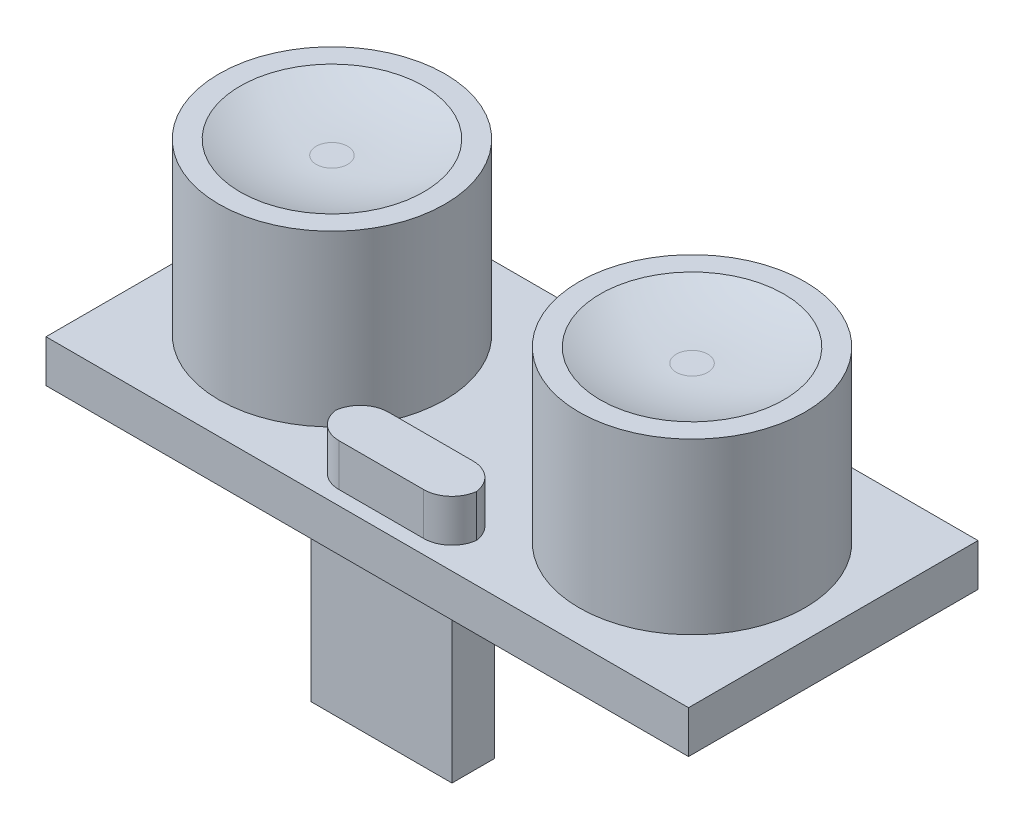
ISO-10303-21;
HEADER;
FILE_DESCRIPTION(('STEP AP214'),'2;1');
FILE_NAME('part.step','',(''),(''),'','','');
FILE_SCHEMA(('AUTOMOTIVE_DESIGN { 1 0 10303 214 1 1 1 1 }'));
ENDSEC;
DATA;
#1=APPLICATION_CONTEXT('core data for automotive mechanical design processes');
#2=APPLICATION_PROTOCOL_DEFINITION('international standard','automotive_design',2000,#1);
#3=PRODUCT_CONTEXT('',#1,'mechanical');
#4=PRODUCT('Part','Part','',(#3));
#5=PRODUCT_RELATED_PRODUCT_CATEGORY('part','',(#4));
#6=PRODUCT_DEFINITION_FORMATION('','',#4);
#7=PRODUCT_DEFINITION_CONTEXT('part definition',#1,'design');
#8=PRODUCT_DEFINITION('design','',#6,#7);
#9=PRODUCT_DEFINITION_SHAPE('','',#8);
#10=(LENGTH_UNIT() NAMED_UNIT(*) SI_UNIT(.MILLI.,.METRE.));
#11=(NAMED_UNIT(*) PLANE_ANGLE_UNIT() SI_UNIT($,.RADIAN.));
#12=(NAMED_UNIT(*) SI_UNIT($,.STERADIAN.) SOLID_ANGLE_UNIT());
#13=UNCERTAINTY_MEASURE_WITH_UNIT(LENGTH_MEASURE(1.E-05),#10,'distance_accuracy_value','');
#14=(GEOMETRIC_REPRESENTATION_CONTEXT(3) GLOBAL_UNCERTAINTY_ASSIGNED_CONTEXT((#13)) GLOBAL_UNIT_ASSIGNED_CONTEXT((#10,
#11,#12)) REPRESENTATION_CONTEXT('',''));
#15=CARTESIAN_POINT('',(0.,0.,0.));
#16=DIRECTION('',(0.,0.,1.));
#17=DIRECTION('',(1.,0.,0.));
#18=AXIS2_PLACEMENT_3D('',#15,#16,#17);
#19=CARTESIAN_POINT('',(0.,3.,0.));
#20=DIRECTION('',(0.,-1.,0.));
#21=DIRECTION('',(0.,0.,-1.));
#22=AXIS2_PLACEMENT_3D('',#19,#20,#21);
#23=PLANE('',#22);
#24=DIRECTION('',(0.,0.,1.));
#25=VECTOR('',#24,1.);
#26=CARTESIAN_POINT('',(0.,3.,0.));
#27=LINE('',#26,#25);
#28=CARTESIAN_POINT('',(0.,3.,-20.5));
#29=VERTEX_POINT('',#28);
#30=CARTESIAN_POINT('',(0.,3.,0.));
#31=VERTEX_POINT('',#30);
#32=EDGE_CURVE('E186',#29,#31,#27,.T.);
#33=ORIENTED_EDGE('',*,*,#32,.T.);
#34=DIRECTION('',(1.,0.,0.));
#35=VECTOR('',#34,1.);
#36=CARTESIAN_POINT('',(0.,3.,0.));
#37=LINE('',#36,#35);
#38=CARTESIAN_POINT('',(45.5,3.,0.));
#39=VERTEX_POINT('',#38);
#40=EDGE_CURVE('E190',#31,#39,#37,.T.);
#41=ORIENTED_EDGE('',*,*,#40,.T.);
#42=DIRECTION('',(0.,0.,-1.));
#43=VECTOR('',#42,1.);
#44=CARTESIAN_POINT('',(45.5,3.,0.));
#45=LINE('',#44,#43);
#46=CARTESIAN_POINT('',(45.5,3.,-20.5));
#47=VERTEX_POINT('',#46);
#48=EDGE_CURVE('E194',#39,#47,#45,.T.);
#49=ORIENTED_EDGE('',*,*,#48,.T.);
#50=DIRECTION('',(-1.,0.,0.));
#51=VECTOR('',#50,1.);
#52=CARTESIAN_POINT('',(0.,3.,-20.5));
#53=LINE('',#52,#51);
#54=EDGE_CURVE('E197',#47,#29,#53,.T.);
#55=ORIENTED_EDGE('',*,*,#54,.T.);
#56=EDGE_LOOP('',(#33,#41,#49,#55));
#57=FACE_BOUND('',#56,.T.);
#58=CARTESIAN_POINT('',(10.,3.,-10.25));
#59=DIRECTION('',(0.,-1.,0.));
#60=DIRECTION('',(0.,0.,-1.));
#61=AXIS2_PLACEMENT_3D('',#58,#59,#60);
#62=CIRCLE('',#61,8.);
#63=CARTESIAN_POINT('',(10.,3.,-18.25));
#64=VERTEX_POINT('',#63);
#65=EDGE_CURVE('E227',#64,#64,#62,.F.);
#66=ORIENTED_EDGE('',*,*,#65,.F.);
#67=EDGE_LOOP('',(#66));
#68=FACE_BOUND('',#67,.T.);
#69=CARTESIAN_POINT('',(35.5,3.,-10.25));
#70=DIRECTION('',(0.,-1.,0.));
#71=DIRECTION('',(0.,0.,-1.));
#72=AXIS2_PLACEMENT_3D('',#69,#70,#71);
#73=CIRCLE('',#72,8.);
#74=CARTESIAN_POINT('',(35.5,3.,-18.25));
#75=VERTEX_POINT('',#74);
#76=EDGE_CURVE('E231',#75,#75,#73,.F.);
#77=ORIENTED_EDGE('',*,*,#76,.F.);
#78=EDGE_LOOP('',(#77));
#79=FACE_BOUND('',#78,.T.);
#80=CARTESIAN_POINT('',(19.75,3.,-3.));
#81=DIRECTION('',(0.,-1.,0.));
#82=DIRECTION('',(0.,0.,-1.));
#83=AXIS2_PLACEMENT_3D('',#80,#81,#82);
#84=CIRCLE('',#83,2.);
#85=CARTESIAN_POINT('',(19.75,3.,-1.));
#86=VERTEX_POINT('',#85);
#87=CARTESIAN_POINT('',(17.7656865167016,3.,-2.75));
#88=VERTEX_POINT('',#87);
#89=EDGE_CURVE('E64',#86,#88,#84,.T.);
#90=ORIENTED_EDGE('',*,*,#89,.T.);
#91=CARTESIAN_POINT('',(19.75,3.,-2.5));
#92=DIRECTION('',(0.,-1.,0.));
#93=DIRECTION('',(0.,0.,-1.));
#94=AXIS2_PLACEMENT_3D('',#91,#92,#93);
#95=CIRCLE('',#94,2.);
#96=CARTESIAN_POINT('',(19.75,3.,-4.5));
#97=VERTEX_POINT('',#96);
#98=EDGE_CURVE('E271',#88,#97,#95,.T.);
#99=ORIENTED_EDGE('',*,*,#98,.T.);
#100=DIRECTION('',(-1.,0.,0.));
#101=VECTOR('',#100,1.);
#102=CARTESIAN_POINT('',(17.75,3.,-4.5));
#103=LINE('',#102,#101);
#104=CARTESIAN_POINT('',(25.75,3.,-4.5));
#105=VERTEX_POINT('',#104);
#106=EDGE_CURVE('E285',#105,#97,#103,.T.);
#107=ORIENTED_EDGE('',*,*,#106,.F.);
#108=CARTESIAN_POINT('',(25.75,3.,-2.5));
#109=DIRECTION('',(0.,-1.,0.));
#110=DIRECTION('',(0.,0.,-1.));
#111=AXIS2_PLACEMENT_3D('',#108,#109,#110);
#112=CIRCLE('',#111,2.);
#113=CARTESIAN_POINT('',(27.7343134832984,3.,-2.75));
#114=VERTEX_POINT('',#113);
#115=EDGE_CURVE('E11',#105,#114,#112,.T.);
#116=ORIENTED_EDGE('',*,*,#115,.T.);
#117=CARTESIAN_POINT('',(25.75,3.,-3.));
#118=DIRECTION('',(0.,-1.,0.));
#119=DIRECTION('',(0.,0.,-1.));
#120=AXIS2_PLACEMENT_3D('',#117,#118,#119);
#121=CIRCLE('',#120,2.);
#122=CARTESIAN_POINT('',(25.75,3.,-1.));
#123=VERTEX_POINT('',#122);
#124=EDGE_CURVE('E51',#114,#123,#121,.T.);
#125=ORIENTED_EDGE('',*,*,#124,.T.);
#126=DIRECTION('',(1.,0.,0.));
#127=VECTOR('',#126,1.);
#128=CARTESIAN_POINT('',(17.75,3.,-1.));
#129=LINE('',#128,#127);
#130=EDGE_CURVE('E278',#86,#123,#129,.T.);
#131=ORIENTED_EDGE('',*,*,#130,.F.);
#132=EDGE_LOOP('',(#90,#99,#107,#116,#125,#131));
#133=FACE_BOUND('',#132,.T.);
#134=ADVANCED_FACE('F41',(#57,#68,#79,#133),#23,.F.);
#135=CARTESIAN_POINT('',(0.,0.,0.));
#136=DIRECTION('',(0.,-1.,0.));
#137=DIRECTION('',(0.,0.,-1.));
#138=AXIS2_PLACEMENT_3D('',#135,#136,#137);
#139=PLANE('',#138);
#140=DIRECTION('',(0.,0.,1.));
#141=VECTOR('',#140,1.);
#142=CARTESIAN_POINT('',(0.,0.,0.));
#143=LINE('',#142,#141);
#144=CARTESIAN_POINT('',(0.,0.,-20.5));
#145=VERTEX_POINT('',#144);
#146=CARTESIAN_POINT('',(0.,0.,0.));
#147=VERTEX_POINT('',#146);
#148=EDGE_CURVE('E185',#145,#147,#143,.T.);
#149=ORIENTED_EDGE('',*,*,#148,.F.);
#150=DIRECTION('',(-1.,0.,0.));
#151=VECTOR('',#150,1.);
#152=CARTESIAN_POINT('',(0.,0.,-20.5));
#153=LINE('',#152,#151);
#154=CARTESIAN_POINT('',(45.5,0.,-20.5));
#155=VERTEX_POINT('',#154);
#156=EDGE_CURVE('E191',#155,#145,#153,.T.);
#157=ORIENTED_EDGE('',*,*,#156,.F.);
#158=DIRECTION('',(0.,0.,-1.));
#159=VECTOR('',#158,1.);
#160=CARTESIAN_POINT('',(45.5,0.,0.));
#161=LINE('',#160,#159);
#162=CARTESIAN_POINT('',(45.5,0.,0.));
#163=VERTEX_POINT('',#162);
#164=EDGE_CURVE('E207',#163,#155,#161,.T.);
#165=ORIENTED_EDGE('',*,*,#164,.F.);
#166=DIRECTION('',(1.,0.,0.));
#167=VECTOR('',#166,1.);
#168=CARTESIAN_POINT('',(0.,0.,0.));
#169=LINE('',#168,#167);
#170=EDGE_CURVE('E204',#147,#163,#169,.T.);
#171=ORIENTED_EDGE('',*,*,#170,.F.);
#172=EDGE_LOOP('',(#149,#157,#165,#171));
#173=FACE_BOUND('',#172,.T.);
#174=DIRECTION('',(1.,0.,0.));
#175=VECTOR('',#174,1.);
#176=CARTESIAN_POINT('',(17.75,0.,-4.));
#177=LINE('',#176,#175);
#178=CARTESIAN_POINT('',(17.75,0.,-4.));
#179=VERTEX_POINT('',#178);
#180=CARTESIAN_POINT('',(27.75,0.,-4.));
#181=VERTEX_POINT('',#180);
#182=EDGE_CURVE('E329',#179,#181,#177,.T.);
#183=ORIENTED_EDGE('',*,*,#182,.F.);
#184=DIRECTION('',(0.,0.,-1.));
#185=VECTOR('',#184,1.);
#186=CARTESIAN_POINT('',(17.75,0.,-1.));
#187=LINE('',#186,#185);
#188=CARTESIAN_POINT('',(17.75,0.,-1.));
#189=VERTEX_POINT('',#188);
#190=EDGE_CURVE('E168',#189,#179,#187,.T.);
#191=ORIENTED_EDGE('',*,*,#190,.F.);
#192=DIRECTION('',(-1.,0.,0.));
#193=VECTOR('',#192,1.);
#194=CARTESIAN_POINT('',(17.75,0.,-1.));
#195=LINE('',#194,#193);
#196=CARTESIAN_POINT('',(27.75,0.,-1.));
#197=VERTEX_POINT('',#196);
#198=EDGE_CURVE('E164',#197,#189,#195,.T.);
#199=ORIENTED_EDGE('',*,*,#198,.F.);
#200=DIRECTION('',(0.,0.,1.));
#201=VECTOR('',#200,1.);
#202=CARTESIAN_POINT('',(27.75,0.,-1.));
#203=LINE('',#202,#201);
#204=EDGE_CURVE('E332',#181,#197,#203,.T.);
#205=ORIENTED_EDGE('',*,*,#204,.F.);
#206=EDGE_LOOP('',(#183,#191,#199,#205));
#207=FACE_BOUND('',#206,.T.);
#208=ADVANCED_FACE('F348',(#173,#207),#139,.T.);
#209=CARTESIAN_POINT('',(0.,3.,0.));
#210=DIRECTION('',(1.,0.,0.));
#211=DIRECTION('',(0.,0.,-1.));
#212=AXIS2_PLACEMENT_3D('',#209,#210,#211);
#213=PLANE('',#212);
#214=ORIENTED_EDGE('',*,*,#148,.T.);
#215=DIRECTION('',(0.,-1.,0.));
#216=VECTOR('',#215,1.);
#217=CARTESIAN_POINT('',(0.,3.,0.));
#218=LINE('',#217,#216);
#219=EDGE_CURVE('E223',#31,#147,#218,.T.);
#220=ORIENTED_EDGE('',*,*,#219,.F.);
#221=ORIENTED_EDGE('',*,*,#32,.F.);
#222=DIRECTION('',(0.,-1.,0.));
#223=VECTOR('',#222,1.);
#224=CARTESIAN_POINT('',(0.,3.,-20.5));
#225=LINE('',#224,#223);
#226=EDGE_CURVE('E200',#29,#145,#225,.T.);
#227=ORIENTED_EDGE('',*,*,#226,.T.);
#228=EDGE_LOOP('',(#214,#220,#221,#227));
#229=FACE_BOUND('',#228,.T.);
#230=ADVANCED_FACE('F350',(#229),#213,.F.);
#231=CARTESIAN_POINT('',(0.,3.,0.));
#232=DIRECTION('',(0.,0.,-1.));
#233=DIRECTION('',(-1.,0.,0.));
#234=AXIS2_PLACEMENT_3D('',#231,#232,#233);
#235=PLANE('',#234);
#236=ORIENTED_EDGE('',*,*,#170,.T.);
#237=DIRECTION('',(0.,-1.,0.));
#238=VECTOR('',#237,1.);
#239=CARTESIAN_POINT('',(45.5,3.,0.));
#240=LINE('',#239,#238);
#241=EDGE_CURVE('E219',#39,#163,#240,.T.);
#242=ORIENTED_EDGE('',*,*,#241,.F.);
#243=ORIENTED_EDGE('',*,*,#40,.F.);
#244=ORIENTED_EDGE('',*,*,#219,.T.);
#245=EDGE_LOOP('',(#236,#242,#243,#244));
#246=FACE_BOUND('',#245,.T.);
#247=ADVANCED_FACE('F357',(#246),#235,.F.);
#248=CARTESIAN_POINT('',(45.5,3.,0.));
#249=DIRECTION('',(-1.,0.,0.));
#250=DIRECTION('',(0.,0.,1.));
#251=AXIS2_PLACEMENT_3D('',#248,#249,#250);
#252=PLANE('',#251);
#253=ORIENTED_EDGE('',*,*,#164,.T.);
#254=DIRECTION('',(0.,-1.,0.));
#255=VECTOR('',#254,1.);
#256=CARTESIAN_POINT('',(45.5,3.,-20.5));
#257=LINE('',#256,#255);
#258=EDGE_CURVE('E215',#47,#155,#257,.T.);
#259=ORIENTED_EDGE('',*,*,#258,.F.);
#260=ORIENTED_EDGE('',*,*,#48,.F.);
#261=ORIENTED_EDGE('',*,*,#241,.T.);
#262=EDGE_LOOP('',(#253,#259,#260,#261));
#263=FACE_BOUND('',#262,.T.);
#264=ADVANCED_FACE('F369',(#263),#252,.F.);
#265=CARTESIAN_POINT('',(0.,3.,-20.5));
#266=DIRECTION('',(0.,0.,1.));
#267=DIRECTION('',(1.,0.,0.));
#268=AXIS2_PLACEMENT_3D('',#265,#266,#267);
#269=PLANE('',#268);
#270=ORIENTED_EDGE('',*,*,#156,.T.);
#271=ORIENTED_EDGE('',*,*,#226,.F.);
#272=ORIENTED_EDGE('',*,*,#54,.F.);
#273=ORIENTED_EDGE('',*,*,#258,.T.);
#274=EDGE_LOOP('',(#270,#271,#272,#273));
#275=FACE_BOUND('',#274,.T.);
#276=ADVANCED_FACE('F365',(#275),#269,.F.);
#277=CARTESIAN_POINT('',(10.,15.,-10.25));
#278=DIRECTION('',(0.,-1.,0.));
#279=DIRECTION('',(0.,0.,-1.));
#280=AXIS2_PLACEMENT_3D('',#277,#278,#279);
#281=CYLINDRICAL_SURFACE('',#280,8.);
#282=CARTESIAN_POINT('',(10.,15.,-10.25));
#283=DIRECTION('',(0.,1.,0.));
#284=DIRECTION('',(0.,0.,1.));
#285=AXIS2_PLACEMENT_3D('',#282,#283,#284);
#286=CIRCLE('',#285,8.);
#287=CARTESIAN_POINT('',(10.,15.,-2.25));
#288=VERTEX_POINT('',#287);
#289=EDGE_CURVE('E176',#288,#288,#286,.T.);
#290=ORIENTED_EDGE('',*,*,#289,.F.);
#291=EDGE_LOOP('',(#290));
#292=FACE_BOUND('',#291,.T.);
#293=ORIENTED_EDGE('',*,*,#65,.T.);
#294=EDGE_LOOP('',(#293));
#295=FACE_BOUND('',#294,.T.);
#296=ADVANCED_FACE('F368',(#292,#295),#281,.T.);
#297=CARTESIAN_POINT('',(10.,15.,-10.25));
#298=DIRECTION('',(0.,1.,0.));
#299=DIRECTION('',(0.,0.,1.));
#300=AXIS2_PLACEMENT_3D('',#297,#298,#299);
#301=PLANE('',#300);
#302=CARTESIAN_POINT('',(10.,15.,-10.25));
#303=DIRECTION('',(0.,1.,0.));
#304=DIRECTION('',(0.,0.,1.));
#305=AXIS2_PLACEMENT_3D('',#302,#303,#304);
#306=CIRCLE('',#305,6.5);
#307=CARTESIAN_POINT('',(10.,15.,-3.75));
#308=VERTEX_POINT('',#307);
#309=EDGE_CURVE('E313',#308,#308,#306,.T.);
#310=ORIENTED_EDGE('',*,*,#309,.F.);
#311=EDGE_LOOP('',(#310));
#312=FACE_BOUND('',#311,.T.);
#313=ORIENTED_EDGE('',*,*,#289,.T.);
#314=EDGE_LOOP('',(#313));
#315=FACE_BOUND('',#314,.T.);
#316=ADVANCED_FACE('F497',(#312,#315),#301,.T.);
#317=CARTESIAN_POINT('',(35.5,15.,-10.25));
#318=DIRECTION('',(0.,-1.,0.));
#319=DIRECTION('',(0.,0.,-1.));
#320=AXIS2_PLACEMENT_3D('',#317,#318,#319);
#321=CYLINDRICAL_SURFACE('',#320,8.);
#322=CARTESIAN_POINT('',(35.5,15.,-10.25));
#323=DIRECTION('',(0.,1.,0.));
#324=DIRECTION('',(0.,0.,1.));
#325=AXIS2_PLACEMENT_3D('',#322,#323,#324);
#326=CIRCLE('',#325,8.);
#327=CARTESIAN_POINT('',(35.5,15.,-2.25));
#328=VERTEX_POINT('',#327);
#329=EDGE_CURVE('E171',#328,#328,#326,.T.);
#330=ORIENTED_EDGE('',*,*,#329,.F.);
#331=EDGE_LOOP('',(#330));
#332=FACE_BOUND('',#331,.T.);
#333=ORIENTED_EDGE('',*,*,#76,.T.);
#334=EDGE_LOOP('',(#333));
#335=FACE_BOUND('',#334,.T.);
#336=ADVANCED_FACE('F488',(#332,#335),#321,.T.);
#337=CARTESIAN_POINT('',(35.5,15.,-10.25));
#338=DIRECTION('',(0.,1.,0.));
#339=DIRECTION('',(0.,0.,1.));
#340=AXIS2_PLACEMENT_3D('',#337,#338,#339);
#341=PLANE('',#340);
#342=CARTESIAN_POINT('',(35.5,15.,-10.25));
#343=DIRECTION('',(0.,1.,0.));
#344=DIRECTION('',(0.,0.,1.));
#345=AXIS2_PLACEMENT_3D('',#342,#343,#344);
#346=CIRCLE('',#345,6.5);
#347=CARTESIAN_POINT('',(35.5,15.,-3.75));
#348=VERTEX_POINT('',#347);
#349=EDGE_CURVE('E307',#348,#348,#346,.T.);
#350=ORIENTED_EDGE('',*,*,#349,.F.);
#351=EDGE_LOOP('',(#350));
#352=FACE_BOUND('',#351,.T.);
#353=ORIENTED_EDGE('',*,*,#329,.T.);
#354=EDGE_LOOP('',(#353));
#355=FACE_BOUND('',#354,.T.);
#356=ADVANCED_FACE('F481',(#352,#355),#341,.T.);
#357=CARTESIAN_POINT('',(17.75,-11.,-1.));
#358=DIRECTION('',(1.,0.,0.));
#359=DIRECTION('',(0.,0.,-1.));
#360=AXIS2_PLACEMENT_3D('',#357,#358,#359);
#361=PLANE('',#360);
#362=ORIENTED_EDGE('',*,*,#190,.T.);
#363=DIRECTION('',(0.,1.,0.));
#364=VECTOR('',#363,1.);
#365=CARTESIAN_POINT('',(17.75,-11.,-4.));
#366=LINE('',#365,#364);
#367=CARTESIAN_POINT('',(17.75,-11.,-4.));
#368=VERTEX_POINT('',#367);
#369=EDGE_CURVE('E146',#368,#179,#366,.T.);
#370=ORIENTED_EDGE('',*,*,#369,.F.);
#371=DIRECTION('',(0.,0.,-1.));
#372=VECTOR('',#371,1.);
#373=CARTESIAN_POINT('',(17.75,-11.,-1.));
#374=LINE('',#373,#372);
#375=CARTESIAN_POINT('',(17.75,-11.,-1.));
#376=VERTEX_POINT('',#375);
#377=EDGE_CURVE('E154',#376,#368,#374,.T.);
#378=ORIENTED_EDGE('',*,*,#377,.F.);
#379=DIRECTION('',(0.,1.,0.));
#380=VECTOR('',#379,1.);
#381=CARTESIAN_POINT('',(17.75,-11.,-1.));
#382=LINE('',#381,#380);
#383=EDGE_CURVE('E326',#376,#189,#382,.T.);
#384=ORIENTED_EDGE('',*,*,#383,.T.);
#385=EDGE_LOOP('',(#362,#370,#378,#384));
#386=FACE_BOUND('',#385,.T.);
#387=ADVANCED_FACE('F166',(#386),#361,.F.);
#388=CARTESIAN_POINT('',(17.75,-11.,-4.));
#389=DIRECTION('',(0.,0.,1.));
#390=DIRECTION('',(1.,0.,0.));
#391=AXIS2_PLACEMENT_3D('',#388,#389,#390);
#392=PLANE('',#391);
#393=ORIENTED_EDGE('',*,*,#182,.T.);
#394=DIRECTION('',(0.,1.,0.));
#395=VECTOR('',#394,1.);
#396=CARTESIAN_POINT('',(27.75,-11.,-4.));
#397=LINE('',#396,#395);
#398=CARTESIAN_POINT('',(27.75,-11.,-4.));
#399=VERTEX_POINT('',#398);
#400=EDGE_CURVE('E149',#399,#181,#397,.T.);
#401=ORIENTED_EDGE('',*,*,#400,.F.);
#402=DIRECTION('',(1.,0.,0.));
#403=VECTOR('',#402,1.);
#404=CARTESIAN_POINT('',(17.75,-11.,-4.));
#405=LINE('',#404,#403);
#406=EDGE_CURVE('E142',#368,#399,#405,.T.);
#407=ORIENTED_EDGE('',*,*,#406,.F.);
#408=ORIENTED_EDGE('',*,*,#369,.T.);
#409=EDGE_LOOP('',(#393,#401,#407,#408));
#410=FACE_BOUND('',#409,.T.);
#411=ADVANCED_FACE('F144',(#410),#392,.F.);
#412=CARTESIAN_POINT('',(27.75,-11.,-1.));
#413=DIRECTION('',(-1.,0.,0.));
#414=DIRECTION('',(0.,0.,1.));
#415=AXIS2_PLACEMENT_3D('',#412,#413,#414);
#416=PLANE('',#415);
#417=ORIENTED_EDGE('',*,*,#204,.T.);
#418=DIRECTION('',(0.,1.,0.));
#419=VECTOR('',#418,1.);
#420=CARTESIAN_POINT('',(27.75,-11.,-1.));
#421=LINE('',#420,#419);
#422=CARTESIAN_POINT('',(27.75,-11.,-1.));
#423=VERTEX_POINT('',#422);
#424=EDGE_CURVE('E178',#423,#197,#421,.T.);
#425=ORIENTED_EDGE('',*,*,#424,.F.);
#426=DIRECTION('',(0.,0.,1.));
#427=VECTOR('',#426,1.);
#428=CARTESIAN_POINT('',(27.75,-11.,-1.));
#429=LINE('',#428,#427);
#430=EDGE_CURVE('E153',#399,#423,#429,.T.);
#431=ORIENTED_EDGE('',*,*,#430,.F.);
#432=ORIENTED_EDGE('',*,*,#400,.T.);
#433=EDGE_LOOP('',(#417,#425,#431,#432));
#434=FACE_BOUND('',#433,.T.);
#435=ADVANCED_FACE('F346',(#434),#416,.F.);
#436=CARTESIAN_POINT('',(17.75,-11.,-1.));
#437=DIRECTION('',(0.,0.,-1.));
#438=DIRECTION('',(-1.,0.,0.));
#439=AXIS2_PLACEMENT_3D('',#436,#437,#438);
#440=PLANE('',#439);
#441=ORIENTED_EDGE('',*,*,#198,.T.);
#442=ORIENTED_EDGE('',*,*,#383,.F.);
#443=DIRECTION('',(-1.,0.,0.));
#444=VECTOR('',#443,1.);
#445=CARTESIAN_POINT('',(17.75,-11.,-1.));
#446=LINE('',#445,#444);
#447=EDGE_CURVE('E159',#423,#376,#446,.T.);
#448=ORIENTED_EDGE('',*,*,#447,.F.);
#449=ORIENTED_EDGE('',*,*,#424,.T.);
#450=EDGE_LOOP('',(#441,#442,#448,#449));
#451=FACE_BOUND('',#450,.T.);
#452=ADVANCED_FACE('F342',(#451),#440,.F.);
#453=CARTESIAN_POINT('',(0.,-11.,0.));
#454=DIRECTION('',(0.,-1.,0.));
#455=DIRECTION('',(0.,0.,-1.));
#456=AXIS2_PLACEMENT_3D('',#453,#454,#455);
#457=PLANE('',#456);
#458=ORIENTED_EDGE('',*,*,#377,.T.);
#459=ORIENTED_EDGE('',*,*,#406,.T.);
#460=ORIENTED_EDGE('',*,*,#430,.T.);
#461=ORIENTED_EDGE('',*,*,#447,.T.);
#462=EDGE_LOOP('',(#458,#459,#460,#461));
#463=FACE_BOUND('',#462,.T.);
#464=ADVANCED_FACE('F157',(#463),#457,.T.);
#465=CARTESIAN_POINT('',(35.5,14.,-10.25));
#466=DIRECTION('',(0.,1.,0.));
#467=DIRECTION('',(0.,0.,1.));
#468=AXIS2_PLACEMENT_3D('',#465,#466,#467);
#469=PLANE('',#468);
#470=CARTESIAN_POINT('',(35.5,14.,-10.25));
#471=DIRECTION('',(0.,1.,0.));
#472=DIRECTION('',(0.,0.,1.));
#473=AXIS2_PLACEMENT_3D('',#470,#471,#472);
#474=CIRCLE('',#473,1.11483519286549);
#475=CARTESIAN_POINT('',(35.5,14.,-9.13516480713451));
#476=VERTEX_POINT('',#475);
#477=EDGE_CURVE('E235',#476,#476,#474,.T.);
#478=ORIENTED_EDGE('',*,*,#477,.T.);
#479=EDGE_LOOP('',(#478));
#480=FACE_BOUND('',#479,.T.);
#481=ADVANCED_FACE('F441',(#480),#469,.T.);
#482=CARTESIAN_POINT('',(10.,14.,-10.25));
#483=DIRECTION('',(0.,1.,0.));
#484=DIRECTION('',(0.,0.,1.));
#485=AXIS2_PLACEMENT_3D('',#482,#483,#484);
#486=PLANE('',#485);
#487=CARTESIAN_POINT('',(10.,14.,-10.25));
#488=DIRECTION('',(0.,1.,0.));
#489=DIRECTION('',(0.,0.,1.));
#490=AXIS2_PLACEMENT_3D('',#487,#488,#489);
#491=CIRCLE('',#490,1.11483519286549);
#492=CARTESIAN_POINT('',(10.,14.,-9.13516480713451));
#493=VERTEX_POINT('',#492);
#494=EDGE_CURVE('E239',#493,#493,#491,.T.);
#495=ORIENTED_EDGE('',*,*,#494,.T.);
#496=EDGE_LOOP('',(#495));
#497=FACE_BOUND('',#496,.T.);
#498=ADVANCED_FACE('F381',(#497),#486,.T.);
#499=CARTESIAN_POINT('',(35.5,29.,-10.25));
#500=DIRECTION('',(0.,-1.,0.));
#501=DIRECTION('',(0.,0.,-1.));
#502=AXIS2_PLACEMENT_3D('',#499,#500,#501);
#503=DEGENERATE_TOROIDAL_SURFACE('',#502,1.11483519286549,15.,.T.);
#504=ORIENTED_EDGE('',*,*,#349,.T.);
#505=EDGE_LOOP('',(#504));
#506=FACE_BOUND('',#505,.T.);
#507=ORIENTED_EDGE('',*,*,#477,.F.);
#508=EDGE_LOOP('',(#507));
#509=FACE_BOUND('',#508,.T.);
#510=ADVANCED_FACE('F377',(#506,#509),#503,.F.);
#511=CARTESIAN_POINT('',(10.,29.,-10.25));
#512=DIRECTION('',(0.,-1.,0.));
#513=DIRECTION('',(0.,0.,-1.));
#514=AXIS2_PLACEMENT_3D('',#511,#512,#513);
#515=DEGENERATE_TOROIDAL_SURFACE('',#514,1.11483519286549,15.,.T.);
#516=ORIENTED_EDGE('',*,*,#309,.T.);
#517=EDGE_LOOP('',(#516));
#518=FACE_BOUND('',#517,.T.);
#519=ORIENTED_EDGE('',*,*,#494,.F.);
#520=EDGE_LOOP('',(#519));
#521=FACE_BOUND('',#520,.T.);
#522=ADVANCED_FACE('F380',(#518,#521),#515,.F.);
#523=CARTESIAN_POINT('',(17.75,6.,-1.));
#524=DIRECTION('',(0.,0.,-1.));
#525=DIRECTION('',(-1.,0.,0.));
#526=AXIS2_PLACEMENT_3D('',#523,#524,#525);
#527=PLANE('',#526);
#528=DIRECTION('',(1.,0.,0.));
#529=VECTOR('',#528,1.);
#530=CARTESIAN_POINT('',(17.75,6.,-1.));
#531=LINE('',#530,#529);
#532=CARTESIAN_POINT('',(19.75,6.,-1.));
#533=VERTEX_POINT('',#532);
#534=CARTESIAN_POINT('',(25.75,6.,-1.));
#535=VERTEX_POINT('',#534);
#536=EDGE_CURVE('E308',#533,#535,#531,.T.);
#537=ORIENTED_EDGE('',*,*,#536,.F.);
#538=DIRECTION('',(0.,-1.,0.));
#539=VECTOR('',#538,1.);
#540=CARTESIAN_POINT('',(19.75,6.,-1.));
#541=LINE('',#540,#539);
#542=EDGE_CURVE('E247',#533,#86,#541,.T.);
#543=ORIENTED_EDGE('',*,*,#542,.T.);
#544=ORIENTED_EDGE('',*,*,#130,.T.);
#545=DIRECTION('',(0.,-1.,0.));
#546=VECTOR('',#545,1.);
#547=CARTESIAN_POINT('',(25.75,6.,-1.));
#548=LINE('',#547,#546);
#549=EDGE_CURVE('E243',#123,#535,#548,.F.);
#550=ORIENTED_EDGE('',*,*,#549,.T.);
#551=EDGE_LOOP('',(#537,#543,#544,#550));
#552=FACE_BOUND('',#551,.T.);
#553=ADVANCED_FACE('F385',(#552),#527,.F.);
#554=CARTESIAN_POINT('',(17.75,6.,-4.5));
#555=DIRECTION('',(0.,0.,1.));
#556=DIRECTION('',(1.,0.,0.));
#557=AXIS2_PLACEMENT_3D('',#554,#555,#556);
#558=PLANE('',#557);
#559=ORIENTED_EDGE('',*,*,#106,.T.);
#560=DIRECTION('',(0.,-1.,0.));
#561=VECTOR('',#560,1.);
#562=CARTESIAN_POINT('',(19.75,6.,-4.5));
#563=LINE('',#562,#561);
#564=CARTESIAN_POINT('',(19.75,6.,-4.5));
#565=VERTEX_POINT('',#564);
#566=EDGE_CURVE('E266',#97,#565,#563,.F.);
#567=ORIENTED_EDGE('',*,*,#566,.T.);
#568=DIRECTION('',(-1.,0.,0.));
#569=VECTOR('',#568,1.);
#570=CARTESIAN_POINT('',(17.75,6.,-4.5));
#571=LINE('',#570,#569);
#572=CARTESIAN_POINT('',(25.75,6.,-4.5));
#573=VERTEX_POINT('',#572);
#574=EDGE_CURVE('E299',#573,#565,#571,.T.);
#575=ORIENTED_EDGE('',*,*,#574,.F.);
#576=DIRECTION('',(0.,-1.,0.));
#577=VECTOR('',#576,1.);
#578=CARTESIAN_POINT('',(25.75,6.,-4.5));
#579=LINE('',#578,#577);
#580=EDGE_CURVE('E263',#573,#105,#579,.T.);
#581=ORIENTED_EDGE('',*,*,#580,.T.);
#582=EDGE_LOOP('',(#559,#567,#575,#581));
#583=FACE_BOUND('',#582,.T.);
#584=ADVANCED_FACE('F304',(#583),#558,.F.);
#585=CARTESIAN_POINT('',(0.,6.,0.));
#586=DIRECTION('',(0.,1.,0.));
#587=DIRECTION('',(0.,0.,1.));
#588=AXIS2_PLACEMENT_3D('',#585,#586,#587);
#589=PLANE('',#588);
#590=CARTESIAN_POINT('',(19.75,6.,-2.5));
#591=DIRECTION('',(0.,1.,0.));
#592=DIRECTION('',(0.,0.,1.));
#593=AXIS2_PLACEMENT_3D('',#590,#591,#592);
#594=CIRCLE('',#593,2.);
#595=CARTESIAN_POINT('',(17.7656865167016,6.,-2.75));
#596=VERTEX_POINT('',#595);
#597=EDGE_CURVE('E257',#565,#596,#594,.T.);
#598=ORIENTED_EDGE('',*,*,#597,.T.);
#599=CARTESIAN_POINT('',(19.75,6.,-3.));
#600=DIRECTION('',(0.,1.,0.));
#601=DIRECTION('',(0.,0.,1.));
#602=AXIS2_PLACEMENT_3D('',#599,#600,#601);
#603=CIRCLE('',#602,2.);
#604=EDGE_CURVE('E260',#596,#533,#603,.T.);
#605=ORIENTED_EDGE('',*,*,#604,.T.);
#606=ORIENTED_EDGE('',*,*,#536,.T.);
#607=CARTESIAN_POINT('',(25.75,6.,-3.));
#608=DIRECTION('',(0.,1.,0.));
#609=DIRECTION('',(0.,0.,1.));
#610=AXIS2_PLACEMENT_3D('',#607,#608,#609);
#611=CIRCLE('',#610,2.);
#612=CARTESIAN_POINT('',(27.7343134832984,6.,-2.75));
#613=VERTEX_POINT('',#612);
#614=EDGE_CURVE('E254',#535,#613,#611,.T.);
#615=ORIENTED_EDGE('',*,*,#614,.T.);
#616=CARTESIAN_POINT('',(25.75,6.,-2.5));
#617=DIRECTION('',(0.,1.,0.));
#618=DIRECTION('',(0.,0.,1.));
#619=AXIS2_PLACEMENT_3D('',#616,#617,#618);
#620=CIRCLE('',#619,2.);
#621=EDGE_CURVE('E251',#613,#573,#620,.T.);
#622=ORIENTED_EDGE('',*,*,#621,.T.);
#623=ORIENTED_EDGE('',*,*,#574,.T.);
#624=EDGE_LOOP('',(#598,#605,#606,#615,#622,#623));
#625=FACE_BOUND('',#624,.T.);
#626=ADVANCED_FACE('F298',(#625),#589,.T.);
#627=CARTESIAN_POINT('',(19.75,6.,-2.5));
#628=DIRECTION('',(0.,-1.,0.));
#629=DIRECTION('',(0.,0.,-1.));
#630=AXIS2_PLACEMENT_3D('',#627,#628,#629);
#631=CYLINDRICAL_SURFACE('',#630,2.);
#632=DIRECTION('',(0.,-1.,0.));
#633=VECTOR('',#632,1.);
#634=CARTESIAN_POINT('',(17.7656865167016,4.5,-2.75));
#635=LINE('',#634,#633);
#636=EDGE_CURVE('E275',#596,#88,#635,.T.);
#637=ORIENTED_EDGE('',*,*,#636,.F.);
#638=ORIENTED_EDGE('',*,*,#597,.F.);
#639=ORIENTED_EDGE('',*,*,#566,.F.);
#640=ORIENTED_EDGE('',*,*,#98,.F.);
#641=EDGE_LOOP('',(#637,#638,#639,#640));
#642=FACE_BOUND('',#641,.T.);
#643=ADVANCED_FACE('F390',(#642),#631,.T.);
#644=CARTESIAN_POINT('',(19.75,6.,-3.));
#645=DIRECTION('',(0.,-1.,0.));
#646=DIRECTION('',(0.,0.,-1.));
#647=AXIS2_PLACEMENT_3D('',#644,#645,#646);
#648=CYLINDRICAL_SURFACE('',#647,2.);
#649=ORIENTED_EDGE('',*,*,#604,.F.);
#650=ORIENTED_EDGE('',*,*,#636,.T.);
#651=ORIENTED_EDGE('',*,*,#89,.F.);
#652=ORIENTED_EDGE('',*,*,#542,.F.);
#653=EDGE_LOOP('',(#649,#650,#651,#652));
#654=FACE_BOUND('',#653,.T.);
#655=ADVANCED_FACE('F387',(#654),#648,.T.);
#656=CARTESIAN_POINT('',(25.75,6.,-2.5));
#657=DIRECTION('',(0.,-1.,0.));
#658=DIRECTION('',(0.,0.,-1.));
#659=AXIS2_PLACEMENT_3D('',#656,#657,#658);
#660=CYLINDRICAL_SURFACE('',#659,2.);
#661=ORIENTED_EDGE('',*,*,#580,.F.);
#662=ORIENTED_EDGE('',*,*,#621,.F.);
#663=DIRECTION('',(0.,-1.,0.));
#664=VECTOR('',#663,1.);
#665=CARTESIAN_POINT('',(27.7343134832984,4.5,-2.75));
#666=LINE('',#665,#664);
#667=EDGE_CURVE('E45',#114,#613,#666,.F.);
#668=ORIENTED_EDGE('',*,*,#667,.F.);
#669=ORIENTED_EDGE('',*,*,#115,.F.);
#670=EDGE_LOOP('',(#661,#662,#668,#669));
#671=FACE_BOUND('',#670,.T.);
#672=ADVANCED_FACE('F43',(#671),#660,.T.);
#673=CARTESIAN_POINT('',(25.75,6.,-3.));
#674=DIRECTION('',(0.,-1.,0.));
#675=DIRECTION('',(0.,0.,-1.));
#676=AXIS2_PLACEMENT_3D('',#673,#674,#675);
#677=CYLINDRICAL_SURFACE('',#676,2.);
#678=ORIENTED_EDGE('',*,*,#614,.F.);
#679=ORIENTED_EDGE('',*,*,#549,.F.);
#680=ORIENTED_EDGE('',*,*,#124,.F.);
#681=ORIENTED_EDGE('',*,*,#667,.T.);
#682=EDGE_LOOP('',(#678,#679,#680,#681));
#683=FACE_BOUND('',#682,.T.);
#684=ADVANCED_FACE('F290',(#683),#677,.T.);
#685=CLOSED_SHELL('',(#134,#208,#230,#247,#264,#276,#296,#316,#336,#356,#387,#411,#435,#452,
#464,#481,#498,#510,#522,#553,#584,#626,#643,#655,#672,#684));
#686=MANIFOLD_SOLID_BREP('B2',#685);
#687=ADVANCED_BREP_SHAPE_REPRESENTATION('',(#18,#686),#14);
#688=SHAPE_DEFINITION_REPRESENTATION(#9,#687);
ENDSEC;
END-ISO-10303-21;
